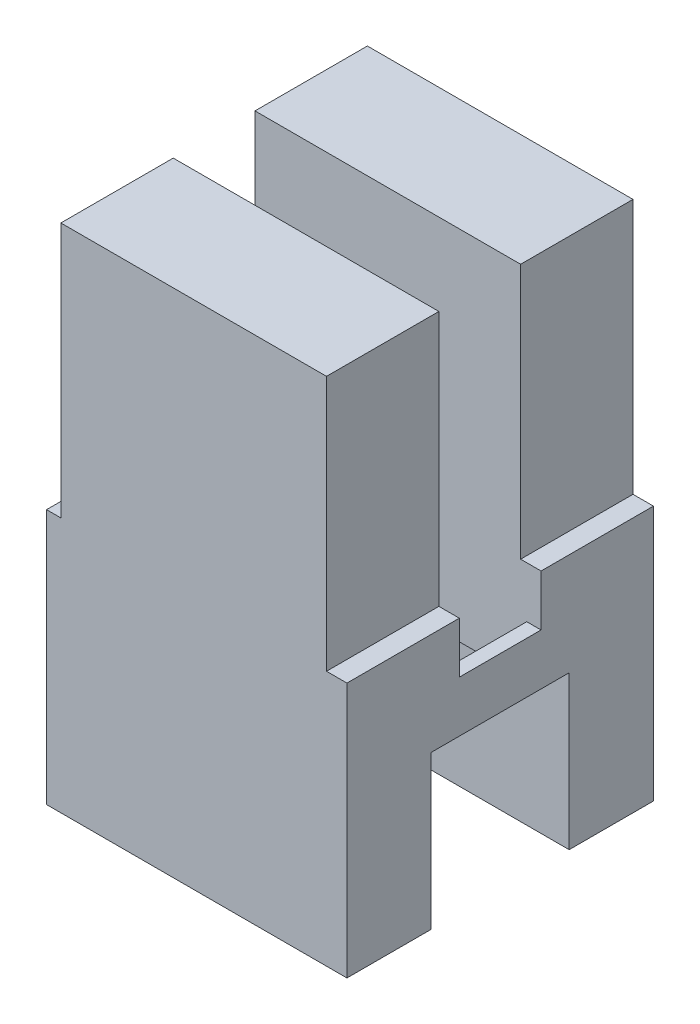
ISO-10303-21;
HEADER;
FILE_DESCRIPTION(('STEP AP214'),'2;1');
FILE_NAME('part.step','',(''),(''),'','','');
FILE_SCHEMA(('AUTOMOTIVE_DESIGN { 1 0 10303 214 1 1 1 1 }'));
ENDSEC;
DATA;
#1=APPLICATION_CONTEXT('core data for automotive mechanical design processes');
#2=APPLICATION_PROTOCOL_DEFINITION('international standard','automotive_design',2000,#1);
#3=PRODUCT_CONTEXT('',#1,'mechanical');
#4=PRODUCT('Part','Part','',(#3));
#5=PRODUCT_RELATED_PRODUCT_CATEGORY('part','',(#4));
#6=PRODUCT_DEFINITION_FORMATION('','',#4);
#7=PRODUCT_DEFINITION_CONTEXT('part definition',#1,'design');
#8=PRODUCT_DEFINITION('design','',#6,#7);
#9=PRODUCT_DEFINITION_SHAPE('','',#8);
#10=(LENGTH_UNIT() NAMED_UNIT(*) SI_UNIT(.MILLI.,.METRE.));
#11=(NAMED_UNIT(*) PLANE_ANGLE_UNIT() SI_UNIT($,.RADIAN.));
#12=(NAMED_UNIT(*) SI_UNIT($,.STERADIAN.) SOLID_ANGLE_UNIT());
#13=UNCERTAINTY_MEASURE_WITH_UNIT(LENGTH_MEASURE(1.E-05),#10,'distance_accuracy_value','');
#14=(GEOMETRIC_REPRESENTATION_CONTEXT(3) GLOBAL_UNCERTAINTY_ASSIGNED_CONTEXT((#13)) GLOBAL_UNIT_ASSIGNED_CONTEXT((#10,
#11,#12)) REPRESENTATION_CONTEXT('',''));
#15=CARTESIAN_POINT('',(0.,0.,0.));
#16=DIRECTION('',(0.,0.,1.));
#17=DIRECTION('',(1.,0.,0.));
#18=AXIS2_PLACEMENT_3D('',#15,#16,#17);
#19=CARTESIAN_POINT('',(18.669,63.5,-19.05));
#20=DIRECTION('',(-1.,0.,0.));
#21=DIRECTION('',(0.,0.,1.));
#22=AXIS2_PLACEMENT_3D('',#19,#20,#21);
#23=PLANE('',#22);
#24=DIRECTION('',(0.,0.,1.));
#25=VECTOR('',#24,1.);
#26=CARTESIAN_POINT('',(18.669,31.75,-19.05));
#27=LINE('',#26,#25);
#28=CARTESIAN_POINT('',(18.669,31.75,5.08));
#29=VERTEX_POINT('',#28);
#30=CARTESIAN_POINT('',(18.669,31.75,19.05));
#31=VERTEX_POINT('',#30);
#32=EDGE_CURVE('E59',#29,#31,#27,.T.);
#33=ORIENTED_EDGE('',*,*,#32,.T.);
#34=DIRECTION('',(0.,-1.,0.));
#35=VECTOR('',#34,1.);
#36=CARTESIAN_POINT('',(18.669,63.5,19.05));
#37=LINE('',#36,#35);
#38=CARTESIAN_POINT('',(18.669,0.,19.05));
#39=VERTEX_POINT('',#38);
#40=EDGE_CURVE('E227',#31,#39,#37,.T.);
#41=ORIENTED_EDGE('',*,*,#40,.T.);
#42=DIRECTION('',(0.,0.,-1.));
#43=VECTOR('',#42,1.);
#44=CARTESIAN_POINT('',(18.669,0.,-19.05));
#45=LINE('',#44,#43);
#46=CARTESIAN_POINT('',(18.669,0.,8.5725));
#47=VERTEX_POINT('',#46);
#48=EDGE_CURVE('E236',#39,#47,#45,.T.);
#49=ORIENTED_EDGE('',*,*,#48,.T.);
#50=DIRECTION('',(0.,-1.,0.));
#51=VECTOR('',#50,1.);
#52=CARTESIAN_POINT('',(18.669,66.4862175066043,8.5725));
#53=LINE('',#52,#51);
#54=CARTESIAN_POINT('',(18.669,19.05,8.5725));
#55=VERTEX_POINT('',#54);
#56=EDGE_CURVE('E304',#55,#47,#53,.T.);
#57=ORIENTED_EDGE('',*,*,#56,.F.);
#58=DIRECTION('',(0.,0.,1.));
#59=VECTOR('',#58,1.);
#60=CARTESIAN_POINT('',(18.669,19.05,-8.5725));
#61=LINE('',#60,#59);
#62=CARTESIAN_POINT('',(18.669,19.05,-8.5725));
#63=VERTEX_POINT('',#62);
#64=EDGE_CURVE('E370',#63,#55,#61,.T.);
#65=ORIENTED_EDGE('',*,*,#64,.F.);
#66=DIRECTION('',(0.,-1.,0.));
#67=VECTOR('',#66,1.);
#68=CARTESIAN_POINT('',(18.669,66.4862175066043,-8.5725));
#69=LINE('',#68,#67);
#70=CARTESIAN_POINT('',(18.669,0.,-8.5725));
#71=VERTEX_POINT('',#70);
#72=EDGE_CURVE('E373',#63,#71,#69,.T.);
#73=ORIENTED_EDGE('',*,*,#72,.T.);
#74=CARTESIAN_POINT('',(18.669,0.,-19.05));
#75=VERTEX_POINT('',#74);
#76=EDGE_CURVE('E240',#71,#75,#45,.T.);
#77=ORIENTED_EDGE('',*,*,#76,.T.);
#78=DIRECTION('',(0.,-1.,0.));
#79=VECTOR('',#78,1.);
#80=CARTESIAN_POINT('',(18.669,63.5,-19.05));
#81=LINE('',#80,#79);
#82=CARTESIAN_POINT('',(18.669,31.75,-19.05));
#83=VERTEX_POINT('',#82);
#84=EDGE_CURVE('E251',#83,#75,#81,.T.);
#85=ORIENTED_EDGE('',*,*,#84,.F.);
#86=CARTESIAN_POINT('',(18.669,31.75,-5.08));
#87=VERTEX_POINT('',#86);
#88=EDGE_CURVE('E273',#83,#87,#27,.T.);
#89=ORIENTED_EDGE('',*,*,#88,.T.);
#90=DIRECTION('',(0.,1.,0.));
#91=VECTOR('',#90,1.);
#92=CARTESIAN_POINT('',(18.669,25.4,-5.08));
#93=LINE('',#92,#91);
#94=CARTESIAN_POINT('',(18.669,25.4,-5.08));
#95=VERTEX_POINT('',#94);
#96=EDGE_CURVE('E233',#95,#87,#93,.T.);
#97=ORIENTED_EDGE('',*,*,#96,.F.);
#98=DIRECTION('',(0.,0.,-1.));
#99=VECTOR('',#98,1.);
#100=CARTESIAN_POINT('',(18.669,25.4,-5.08));
#101=LINE('',#100,#99);
#102=CARTESIAN_POINT('',(18.669,25.4,5.08));
#103=VERTEX_POINT('',#102);
#104=EDGE_CURVE('E307',#103,#95,#101,.T.);
#105=ORIENTED_EDGE('',*,*,#104,.F.);
#106=DIRECTION('',(0.,1.,0.));
#107=VECTOR('',#106,1.);
#108=CARTESIAN_POINT('',(18.669,25.4,5.08));
#109=LINE('',#108,#107);
#110=EDGE_CURVE('E308',#103,#29,#109,.T.);
#111=ORIENTED_EDGE('',*,*,#110,.T.);
#112=EDGE_LOOP('',(#33,#41,#49,#57,#65,#73,#77,#85,#89,#97,#105,#111));
#113=FACE_BOUND('',#112,.T.);
#114=ADVANCED_FACE('F37',(#113),#23,.F.);
#115=CARTESIAN_POINT('',(-18.669,63.5,-19.05));
#116=DIRECTION('',(1.,0.,0.));
#117=DIRECTION('',(0.,0.,-1.));
#118=AXIS2_PLACEMENT_3D('',#115,#116,#117);
#119=PLANE('',#118);
#120=DIRECTION('',(0.,0.,-1.));
#121=VECTOR('',#120,1.);
#122=CARTESIAN_POINT('',(-18.669,31.75,-19.05));
#123=LINE('',#122,#121);
#124=CARTESIAN_POINT('',(-18.669,31.75,-5.08));
#125=VERTEX_POINT('',#124);
#126=CARTESIAN_POINT('',(-18.669,31.75,-19.05));
#127=VERTEX_POINT('',#126);
#128=EDGE_CURVE('E328',#125,#127,#123,.T.);
#129=ORIENTED_EDGE('',*,*,#128,.T.);
#130=DIRECTION('',(0.,-1.,0.));
#131=VECTOR('',#130,1.);
#132=CARTESIAN_POINT('',(-18.669,63.5,-19.05));
#133=LINE('',#132,#131);
#134=CARTESIAN_POINT('',(-18.669,0.,-19.05));
#135=VERTEX_POINT('',#134);
#136=EDGE_CURVE('E249',#127,#135,#133,.T.);
#137=ORIENTED_EDGE('',*,*,#136,.T.);
#138=DIRECTION('',(0.,0.,1.));
#139=VECTOR('',#138,1.);
#140=CARTESIAN_POINT('',(-18.669,0.,-19.05));
#141=LINE('',#140,#139);
#142=CARTESIAN_POINT('',(-18.669,0.,-8.5725));
#143=VERTEX_POINT('',#142);
#144=EDGE_CURVE('E230',#135,#143,#141,.T.);
#145=ORIENTED_EDGE('',*,*,#144,.T.);
#146=DIRECTION('',(0.,-1.,0.));
#147=VECTOR('',#146,1.);
#148=CARTESIAN_POINT('',(-18.669,66.4862175066043,-8.5725));
#149=LINE('',#148,#147);
#150=CARTESIAN_POINT('',(-18.669,19.05,-8.5725));
#151=VERTEX_POINT('',#150);
#152=EDGE_CURVE('E377',#151,#143,#149,.T.);
#153=ORIENTED_EDGE('',*,*,#152,.F.);
#154=DIRECTION('',(0.,0.,-1.));
#155=VECTOR('',#154,1.);
#156=CARTESIAN_POINT('',(-18.669,19.05,-8.5725));
#157=LINE('',#156,#155);
#158=CARTESIAN_POINT('',(-18.669,19.05,8.5725));
#159=VERTEX_POINT('',#158);
#160=EDGE_CURVE('E378',#159,#151,#157,.T.);
#161=ORIENTED_EDGE('',*,*,#160,.F.);
#162=DIRECTION('',(0.,-1.,0.));
#163=VECTOR('',#162,1.);
#164=CARTESIAN_POINT('',(-18.669,66.4862175066043,8.5725));
#165=LINE('',#164,#163);
#166=CARTESIAN_POINT('',(-18.669,0.,8.5725));
#167=VERTEX_POINT('',#166);
#168=EDGE_CURVE('E369',#159,#167,#165,.T.);
#169=ORIENTED_EDGE('',*,*,#168,.T.);
#170=CARTESIAN_POINT('',(-18.669,0.,19.05));
#171=VERTEX_POINT('',#170);
#172=EDGE_CURVE('E243',#167,#171,#141,.T.);
#173=ORIENTED_EDGE('',*,*,#172,.T.);
#174=DIRECTION('',(0.,-1.,0.));
#175=VECTOR('',#174,1.);
#176=CARTESIAN_POINT('',(-18.669,63.5,19.05));
#177=LINE('',#176,#175);
#178=CARTESIAN_POINT('',(-18.669,31.75,19.05));
#179=VERTEX_POINT('',#178);
#180=EDGE_CURVE('E247',#179,#171,#177,.T.);
#181=ORIENTED_EDGE('',*,*,#180,.F.);
#182=CARTESIAN_POINT('',(-18.669,31.75,5.08));
#183=VERTEX_POINT('',#182);
#184=EDGE_CURVE('E324',#179,#183,#123,.T.);
#185=ORIENTED_EDGE('',*,*,#184,.T.);
#186=DIRECTION('',(0.,1.,0.));
#187=VECTOR('',#186,1.);
#188=CARTESIAN_POINT('',(-18.669,25.4,5.08));
#189=LINE('',#188,#187);
#190=CARTESIAN_POINT('',(-18.669,25.4,5.08));
#191=VERTEX_POINT('',#190);
#192=EDGE_CURVE('E291',#191,#183,#189,.T.);
#193=ORIENTED_EDGE('',*,*,#192,.F.);
#194=DIRECTION('',(0.,0.,1.));
#195=VECTOR('',#194,1.);
#196=CARTESIAN_POINT('',(-18.669,25.4,-5.08));
#197=LINE('',#196,#195);
#198=CARTESIAN_POINT('',(-18.669,25.4,-5.08));
#199=VERTEX_POINT('',#198);
#200=EDGE_CURVE('E298',#199,#191,#197,.T.);
#201=ORIENTED_EDGE('',*,*,#200,.F.);
#202=DIRECTION('',(0.,1.,0.));
#203=VECTOR('',#202,1.);
#204=CARTESIAN_POINT('',(-18.669,25.4,-5.08));
#205=LINE('',#204,#203);
#206=EDGE_CURVE('E288',#199,#125,#205,.T.);
#207=ORIENTED_EDGE('',*,*,#206,.T.);
#208=EDGE_LOOP('',(#129,#137,#145,#153,#161,#169,#173,#181,#185,#193,#201,#207));
#209=FACE_BOUND('',#208,.T.);
#210=ADVANCED_FACE('F322',(#209),#119,.F.);
#211=CARTESIAN_POINT('',(0.,25.4,0.));
#212=DIRECTION('',(0.,1.,0.));
#213=DIRECTION('',(0.,0.,1.));
#214=AXIS2_PLACEMENT_3D('',#211,#212,#213);
#215=PLANE('',#214);
#216=DIRECTION('',(0.,0.,-1.));
#217=VECTOR('',#216,1.);
#218=CARTESIAN_POINT('',(16.891,25.4,5.08));
#219=LINE('',#218,#217);
#220=CARTESIAN_POINT('',(16.891,25.4,5.08));
#221=VERTEX_POINT('',#220);
#222=CARTESIAN_POINT('',(16.891,25.4,-5.08));
#223=VERTEX_POINT('',#222);
#224=EDGE_CURVE('E349',#221,#223,#219,.T.);
#225=ORIENTED_EDGE('',*,*,#224,.F.);
#226=DIRECTION('',(1.,0.,0.));
#227=VECTOR('',#226,1.);
#228=CARTESIAN_POINT('',(-18.669,25.4,5.08));
#229=LINE('',#228,#227);
#230=EDGE_CURVE('E293',#221,#103,#229,.T.);
#231=ORIENTED_EDGE('',*,*,#230,.T.);
#232=ORIENTED_EDGE('',*,*,#104,.T.);
#233=DIRECTION('',(-1.,0.,0.));
#234=VECTOR('',#233,1.);
#235=CARTESIAN_POINT('',(-18.669,25.4,-5.08));
#236=LINE('',#235,#234);
#237=EDGE_CURVE('E286',#95,#223,#236,.T.);
#238=ORIENTED_EDGE('',*,*,#237,.T.);
#239=EDGE_LOOP('',(#225,#231,#232,#238));
#240=FACE_BOUND('',#239,.T.);
#241=ADVANCED_FACE('F446',(#240),#215,.T.);
#242=CARTESIAN_POINT('',(0.,0.,0.));
#243=DIRECTION('',(0.,1.,0.));
#244=DIRECTION('',(0.,0.,1.));
#245=AXIS2_PLACEMENT_3D('',#242,#243,#244);
#246=PLANE('',#245);
#247=ORIENTED_EDGE('',*,*,#172,.F.);
#248=DIRECTION('',(-1.,0.,0.));
#249=VECTOR('',#248,1.);
#250=CARTESIAN_POINT('',(-18.669,0.,8.5725));
#251=LINE('',#250,#249);
#252=EDGE_CURVE('E357',#47,#167,#251,.T.);
#253=ORIENTED_EDGE('',*,*,#252,.F.);
#254=ORIENTED_EDGE('',*,*,#48,.F.);
#255=DIRECTION('',(1.,0.,0.));
#256=VECTOR('',#255,1.);
#257=CARTESIAN_POINT('',(-18.669,0.,19.05));
#258=LINE('',#257,#256);
#259=EDGE_CURVE('E224',#171,#39,#258,.T.);
#260=ORIENTED_EDGE('',*,*,#259,.F.);
#261=EDGE_LOOP('',(#247,#253,#254,#260));
#262=FACE_BOUND('',#261,.T.);
#263=ADVANCED_FACE('F416',(#262),#246,.F.);
#264=CARTESIAN_POINT('',(0.,63.5,0.));
#265=DIRECTION('',(0.,1.,0.));
#266=DIRECTION('',(0.,0.,1.));
#267=AXIS2_PLACEMENT_3D('',#264,#265,#266);
#268=PLANE('',#267);
#269=DIRECTION('',(0.,0.,1.));
#270=VECTOR('',#269,1.);
#271=CARTESIAN_POINT('',(16.129,63.5,-19.05));
#272=LINE('',#271,#270);
#273=CARTESIAN_POINT('',(16.129,63.5,5.07999999999999));
#274=VERTEX_POINT('',#273);
#275=CARTESIAN_POINT('',(16.129,63.5,19.05));
#276=VERTEX_POINT('',#275);
#277=EDGE_CURVE('E216',#274,#276,#272,.T.);
#278=ORIENTED_EDGE('',*,*,#277,.F.);
#279=DIRECTION('',(1.,0.,0.));
#280=VECTOR('',#279,1.);
#281=CARTESIAN_POINT('',(-18.669,63.5,5.08));
#282=LINE('',#281,#280);
#283=CARTESIAN_POINT('',(-16.891,63.5,5.07999999999999));
#284=VERTEX_POINT('',#283);
#285=EDGE_CURVE('E303',#284,#274,#282,.T.);
#286=ORIENTED_EDGE('',*,*,#285,.F.);
#287=DIRECTION('',(0.,0.,-1.));
#288=VECTOR('',#287,1.);
#289=CARTESIAN_POINT('',(-16.891,63.5,-19.05));
#290=LINE('',#289,#288);
#291=CARTESIAN_POINT('',(-16.891,63.5,19.05));
#292=VERTEX_POINT('',#291);
#293=EDGE_CURVE('E335',#292,#284,#290,.T.);
#294=ORIENTED_EDGE('',*,*,#293,.F.);
#295=DIRECTION('',(1.,0.,0.));
#296=VECTOR('',#295,1.);
#297=CARTESIAN_POINT('',(-18.669,63.5,19.05));
#298=LINE('',#297,#296);
#299=EDGE_CURVE('E223',#292,#276,#298,.T.);
#300=ORIENTED_EDGE('',*,*,#299,.T.);
#301=EDGE_LOOP('',(#278,#286,#294,#300));
#302=FACE_BOUND('',#301,.T.);
#303=ADVANCED_FACE('F455',(#302),#268,.T.);
#304=CARTESIAN_POINT('',(-18.669,63.5,-19.05));
#305=DIRECTION('',(0.,0.,1.));
#306=DIRECTION('',(1.,0.,0.));
#307=AXIS2_PLACEMENT_3D('',#304,#305,#306);
#308=PLANE('',#307);
#309=DIRECTION('',(-1.,0.,0.));
#310=VECTOR('',#309,1.);
#311=CARTESIAN_POINT('',(-18.669,63.5,-19.05));
#312=LINE('',#311,#310);
#313=CARTESIAN_POINT('',(16.129,63.5,-19.05));
#314=VERTEX_POINT('',#313);
#315=CARTESIAN_POINT('',(-16.891,63.5,-19.05));
#316=VERTEX_POINT('',#315);
#317=EDGE_CURVE('E213',#314,#316,#312,.T.);
#318=ORIENTED_EDGE('',*,*,#317,.F.);
#319=DIRECTION('',(0.,1.,0.));
#320=VECTOR('',#319,1.);
#321=CARTESIAN_POINT('',(16.129,-12.7845728010672,-19.05));
#322=LINE('',#321,#320);
#323=CARTESIAN_POINT('',(16.129,31.75,-19.05));
#324=VERTEX_POINT('',#323);
#325=EDGE_CURVE('E196',#324,#314,#322,.T.);
#326=ORIENTED_EDGE('',*,*,#325,.F.);
#327=DIRECTION('',(1.,0.,0.));
#328=VECTOR('',#327,1.);
#329=CARTESIAN_POINT('',(18.669,31.75,-19.05));
#330=LINE('',#329,#328);
#331=EDGE_CURVE('E281',#324,#83,#330,.T.);
#332=ORIENTED_EDGE('',*,*,#331,.T.);
#333=ORIENTED_EDGE('',*,*,#84,.T.);
#334=DIRECTION('',(-1.,0.,0.));
#335=VECTOR('',#334,1.);
#336=CARTESIAN_POINT('',(-18.669,0.,-19.05));
#337=LINE('',#336,#335);
#338=EDGE_CURVE('E239',#75,#135,#337,.T.);
#339=ORIENTED_EDGE('',*,*,#338,.T.);
#340=ORIENTED_EDGE('',*,*,#136,.F.);
#341=DIRECTION('',(1.,0.,0.));
#342=VECTOR('',#341,1.);
#343=CARTESIAN_POINT('',(-18.669,31.75,-19.05));
#344=LINE('',#343,#342);
#345=CARTESIAN_POINT('',(-16.891,31.75,-19.05));
#346=VERTEX_POINT('',#345);
#347=EDGE_CURVE('E331',#127,#346,#344,.T.);
#348=ORIENTED_EDGE('',*,*,#347,.T.);
#349=DIRECTION('',(0.,1.,0.));
#350=VECTOR('',#349,1.);
#351=CARTESIAN_POINT('',(-16.891,-12.7845728010672,-19.05));
#352=LINE('',#351,#350);
#353=EDGE_CURVE('E222',#346,#316,#352,.T.);
#354=ORIENTED_EDGE('',*,*,#353,.T.);
#355=EDGE_LOOP('',(#318,#326,#332,#333,#339,#340,#348,#354));
#356=FACE_BOUND('',#355,.T.);
#357=ADVANCED_FACE('F219',(#356),#308,.F.);
#358=CARTESIAN_POINT('',(-18.669,63.5,19.05));
#359=DIRECTION('',(0.,0.,-1.));
#360=DIRECTION('',(-1.,0.,0.));
#361=AXIS2_PLACEMENT_3D('',#358,#359,#360);
#362=PLANE('',#361);
#363=DIRECTION('',(-1.,0.,0.));
#364=VECTOR('',#363,1.);
#365=CARTESIAN_POINT('',(18.669,31.75,19.05));
#366=LINE('',#365,#364);
#367=CARTESIAN_POINT('',(16.129,31.75,19.05));
#368=VERTEX_POINT('',#367);
#369=EDGE_CURVE('E501',#31,#368,#366,.T.);
#370=ORIENTED_EDGE('',*,*,#369,.T.);
#371=DIRECTION('',(0.,1.,0.));
#372=VECTOR('',#371,1.);
#373=CARTESIAN_POINT('',(16.129,-12.7845728010672,19.05));
#374=LINE('',#373,#372);
#375=EDGE_CURVE('E206',#368,#276,#374,.T.);
#376=ORIENTED_EDGE('',*,*,#375,.T.);
#377=ORIENTED_EDGE('',*,*,#299,.F.);
#378=DIRECTION('',(0.,1.,0.));
#379=VECTOR('',#378,1.);
#380=CARTESIAN_POINT('',(-16.891,-12.7845728010672,19.05));
#381=LINE('',#380,#379);
#382=CARTESIAN_POINT('',(-16.891,31.75,19.05));
#383=VERTEX_POINT('',#382);
#384=EDGE_CURVE('E337',#383,#292,#381,.T.);
#385=ORIENTED_EDGE('',*,*,#384,.F.);
#386=DIRECTION('',(-1.,0.,0.));
#387=VECTOR('',#386,1.);
#388=CARTESIAN_POINT('',(-18.669,31.75,19.05));
#389=LINE('',#388,#387);
#390=EDGE_CURVE('E327',#383,#179,#389,.T.);
#391=ORIENTED_EDGE('',*,*,#390,.T.);
#392=ORIENTED_EDGE('',*,*,#180,.T.);
#393=ORIENTED_EDGE('',*,*,#259,.T.);
#394=ORIENTED_EDGE('',*,*,#40,.F.);
#395=EDGE_LOOP('',(#370,#376,#377,#385,#391,#392,#393,#394));
#396=FACE_BOUND('',#395,.T.);
#397=ADVANCED_FACE('F421',(#396),#362,.F.);
#398=CARTESIAN_POINT('',(16.129,63.5,-5.08));
#399=VERTEX_POINT('',#398);
#400=EDGE_CURVE('E200',#314,#399,#272,.T.);
#401=ORIENTED_EDGE('',*,*,#400,.F.);
#402=ORIENTED_EDGE('',*,*,#317,.T.);
#403=CARTESIAN_POINT('',(-16.891,63.5,-5.08));
#404=VERTEX_POINT('',#403);
#405=EDGE_CURVE('E338',#404,#316,#290,.T.);
#406=ORIENTED_EDGE('',*,*,#405,.F.);
#407=DIRECTION('',(-1.,0.,0.));
#408=VECTOR('',#407,1.);
#409=CARTESIAN_POINT('',(-18.669,63.5,-5.08));
#410=LINE('',#409,#408);
#411=EDGE_CURVE('E215',#399,#404,#410,.T.);
#412=ORIENTED_EDGE('',*,*,#411,.F.);
#413=EDGE_LOOP('',(#401,#402,#406,#412));
#414=FACE_BOUND('',#413,.T.);
#415=ADVANCED_FACE('F211',(#414),#268,.T.);
#416=ORIENTED_EDGE('',*,*,#76,.F.);
#417=DIRECTION('',(1.,0.,0.));
#418=VECTOR('',#417,1.);
#419=CARTESIAN_POINT('',(-18.669,0.,-8.5725));
#420=LINE('',#419,#418);
#421=EDGE_CURVE('E363',#143,#71,#420,.T.);
#422=ORIENTED_EDGE('',*,*,#421,.F.);
#423=ORIENTED_EDGE('',*,*,#144,.F.);
#424=ORIENTED_EDGE('',*,*,#338,.F.);
#425=EDGE_LOOP('',(#416,#422,#423,#424));
#426=FACE_BOUND('',#425,.T.);
#427=ADVANCED_FACE('F401',(#426),#246,.F.);
#428=CARTESIAN_POINT('',(-18.669,25.4,5.08));
#429=DIRECTION('',(0.,0.,1.));
#430=DIRECTION('',(1.,0.,0.));
#431=AXIS2_PLACEMENT_3D('',#428,#429,#430);
#432=PLANE('',#431);
#433=ORIENTED_EDGE('',*,*,#285,.T.);
#434=DIRECTION('',(0.,-1.,0.));
#435=VECTOR('',#434,1.);
#436=CARTESIAN_POINT('',(16.129,25.4,5.08));
#437=LINE('',#436,#435);
#438=CARTESIAN_POINT('',(16.129,31.75,5.08));
#439=VERTEX_POINT('',#438);
#440=EDGE_CURVE('E346',#274,#439,#437,.T.);
#441=ORIENTED_EDGE('',*,*,#440,.T.);
#442=DIRECTION('',(-1.,0.,0.));
#443=VECTOR('',#442,1.);
#444=CARTESIAN_POINT('',(-18.669,31.75,5.08));
#445=LINE('',#444,#443);
#446=EDGE_CURVE('E344',#29,#439,#445,.T.);
#447=ORIENTED_EDGE('',*,*,#446,.F.);
#448=ORIENTED_EDGE('',*,*,#110,.F.);
#449=ORIENTED_EDGE('',*,*,#230,.F.);
#450=DIRECTION('',(0.,1.,0.));
#451=VECTOR('',#450,1.);
#452=CARTESIAN_POINT('',(16.891,0.,5.08));
#453=LINE('',#452,#451);
#454=CARTESIAN_POINT('',(16.891,19.05,5.08));
#455=VERTEX_POINT('',#454);
#456=EDGE_CURVE('E355',#455,#221,#453,.T.);
#457=ORIENTED_EDGE('',*,*,#456,.F.);
#458=DIRECTION('',(1.,0.,0.));
#459=VECTOR('',#458,1.);
#460=CARTESIAN_POINT('',(0.,19.05,5.08));
#461=LINE('',#460,#459);
#462=CARTESIAN_POINT('',(-16.891,19.05,5.08));
#463=VERTEX_POINT('',#462);
#464=EDGE_CURVE('E259',#463,#455,#461,.T.);
#465=ORIENTED_EDGE('',*,*,#464,.F.);
#466=DIRECTION('',(0.,1.,0.));
#467=VECTOR('',#466,1.);
#468=CARTESIAN_POINT('',(-16.891,0.,5.08));
#469=LINE('',#468,#467);
#470=CARTESIAN_POINT('',(-16.891,25.4,5.08));
#471=VERTEX_POINT('',#470);
#472=EDGE_CURVE('E358',#463,#471,#469,.T.);
#473=ORIENTED_EDGE('',*,*,#472,.T.);
#474=EDGE_CURVE('E289',#191,#471,#229,.T.);
#475=ORIENTED_EDGE('',*,*,#474,.F.);
#476=ORIENTED_EDGE('',*,*,#192,.T.);
#477=DIRECTION('',(-1.,0.,0.));
#478=VECTOR('',#477,1.);
#479=CARTESIAN_POINT('',(-18.669,31.75,5.08));
#480=LINE('',#479,#478);
#481=CARTESIAN_POINT('',(-16.891,31.75,5.08));
#482=VERTEX_POINT('',#481);
#483=EDGE_CURVE('E317',#482,#183,#480,.T.);
#484=ORIENTED_EDGE('',*,*,#483,.F.);
#485=DIRECTION('',(0.,1.,0.));
#486=VECTOR('',#485,1.);
#487=CARTESIAN_POINT('',(-16.891,25.4,5.08));
#488=LINE('',#487,#486);
#489=EDGE_CURVE('E342',#482,#284,#488,.T.);
#490=ORIENTED_EDGE('',*,*,#489,.T.);
#491=EDGE_LOOP('',(#433,#441,#447,#448,#449,#457,#465,#473,#475,#476,#484,#490));
#492=FACE_BOUND('',#491,.T.);
#493=ADVANCED_FACE('F315',(#492),#432,.F.);
#494=CARTESIAN_POINT('',(-18.669,25.4,-5.08));
#495=DIRECTION('',(0.,0.,-1.));
#496=DIRECTION('',(-1.,0.,0.));
#497=AXIS2_PLACEMENT_3D('',#494,#495,#496);
#498=PLANE('',#497);
#499=DIRECTION('',(1.,0.,0.));
#500=VECTOR('',#499,1.);
#501=CARTESIAN_POINT('',(-18.669,31.75,-5.08));
#502=LINE('',#501,#500);
#503=CARTESIAN_POINT('',(16.129,31.75,-5.08));
#504=VERTEX_POINT('',#503);
#505=EDGE_CURVE('E44',#504,#87,#502,.T.);
#506=ORIENTED_EDGE('',*,*,#505,.F.);
#507=DIRECTION('',(0.,1.,0.));
#508=VECTOR('',#507,1.);
#509=CARTESIAN_POINT('',(16.129,25.4,-5.08));
#510=LINE('',#509,#508);
#511=EDGE_CURVE('E13',#504,#399,#510,.T.);
#512=ORIENTED_EDGE('',*,*,#511,.T.);
#513=ORIENTED_EDGE('',*,*,#411,.T.);
#514=DIRECTION('',(0.,-1.,0.));
#515=VECTOR('',#514,1.);
#516=CARTESIAN_POINT('',(-16.891,25.4,-5.08));
#517=LINE('',#516,#515);
#518=CARTESIAN_POINT('',(-16.891,31.75,-5.08));
#519=VERTEX_POINT('',#518);
#520=EDGE_CURVE('E267',#404,#519,#517,.T.);
#521=ORIENTED_EDGE('',*,*,#520,.T.);
#522=DIRECTION('',(1.,0.,0.));
#523=VECTOR('',#522,1.);
#524=CARTESIAN_POINT('',(-18.669,31.75,-5.08));
#525=LINE('',#524,#523);
#526=EDGE_CURVE('E265',#125,#519,#525,.T.);
#527=ORIENTED_EDGE('',*,*,#526,.F.);
#528=ORIENTED_EDGE('',*,*,#206,.F.);
#529=CARTESIAN_POINT('',(-16.891,25.4,-5.08));
#530=VERTEX_POINT('',#529);
#531=EDGE_CURVE('E387',#530,#199,#236,.T.);
#532=ORIENTED_EDGE('',*,*,#531,.F.);
#533=DIRECTION('',(0.,1.,0.));
#534=VECTOR('',#533,1.);
#535=CARTESIAN_POINT('',(-16.891,0.,-5.08));
#536=LINE('',#535,#534);
#537=CARTESIAN_POINT('',(-16.891,19.05,-5.08));
#538=VERTEX_POINT('',#537);
#539=EDGE_CURVE('E360',#538,#530,#536,.T.);
#540=ORIENTED_EDGE('',*,*,#539,.F.);
#541=DIRECTION('',(-1.,0.,0.));
#542=VECTOR('',#541,1.);
#543=CARTESIAN_POINT('',(0.,19.05,-5.08));
#544=LINE('',#543,#542);
#545=CARTESIAN_POINT('',(16.891,19.05,-5.08));
#546=VERTEX_POINT('',#545);
#547=EDGE_CURVE('E253',#546,#538,#544,.T.);
#548=ORIENTED_EDGE('',*,*,#547,.F.);
#549=DIRECTION('',(0.,1.,0.));
#550=VECTOR('',#549,1.);
#551=CARTESIAN_POINT('',(16.891,0.,-5.08));
#552=LINE('',#551,#550);
#553=EDGE_CURVE('E354',#546,#223,#552,.T.);
#554=ORIENTED_EDGE('',*,*,#553,.T.);
#555=ORIENTED_EDGE('',*,*,#237,.F.);
#556=ORIENTED_EDGE('',*,*,#96,.T.);
#557=EDGE_LOOP('',(#506,#512,#513,#521,#527,#528,#532,#540,#548,#554,#555,#556));
#558=FACE_BOUND('',#557,.T.);
#559=ADVANCED_FACE('F283',(#558),#498,.F.);
#560=DIRECTION('',(0.,0.,1.));
#561=VECTOR('',#560,1.);
#562=CARTESIAN_POINT('',(-16.891,25.4,5.08));
#563=LINE('',#562,#561);
#564=EDGE_CURVE('E351',#530,#471,#563,.T.);
#565=ORIENTED_EDGE('',*,*,#564,.F.);
#566=ORIENTED_EDGE('',*,*,#531,.T.);
#567=ORIENTED_EDGE('',*,*,#200,.T.);
#568=ORIENTED_EDGE('',*,*,#474,.T.);
#569=EDGE_LOOP('',(#565,#566,#567,#568));
#570=FACE_BOUND('',#569,.T.);
#571=ADVANCED_FACE('F392',(#570),#215,.T.);
#572=CARTESIAN_POINT('',(0.,19.05,0.));
#573=DIRECTION('',(0.,1.,0.));
#574=DIRECTION('',(0.,0.,1.));
#575=AXIS2_PLACEMENT_3D('',#572,#573,#574);
#576=PLANE('',#575);
#577=ORIENTED_EDGE('',*,*,#464,.T.);
#578=DIRECTION('',(0.,0.,-1.));
#579=VECTOR('',#578,1.);
#580=CARTESIAN_POINT('',(16.891,19.05,0.));
#581=LINE('',#580,#579);
#582=EDGE_CURVE('E262',#455,#546,#581,.T.);
#583=ORIENTED_EDGE('',*,*,#582,.T.);
#584=ORIENTED_EDGE('',*,*,#547,.T.);
#585=DIRECTION('',(0.,0.,1.));
#586=VECTOR('',#585,1.);
#587=CARTESIAN_POINT('',(-16.891,19.05,0.));
#588=LINE('',#587,#586);
#589=EDGE_CURVE('E256',#538,#463,#588,.T.);
#590=ORIENTED_EDGE('',*,*,#589,.T.);
#591=EDGE_LOOP('',(#577,#583,#584,#590));
#592=FACE_BOUND('',#591,.T.);
#593=ORIENTED_EDGE('',*,*,#64,.T.);
#594=DIRECTION('',(-1.,0.,0.));
#595=VECTOR('',#594,1.);
#596=CARTESIAN_POINT('',(-18.669,19.05,8.5725));
#597=LINE('',#596,#595);
#598=EDGE_CURVE('E365',#55,#159,#597,.T.);
#599=ORIENTED_EDGE('',*,*,#598,.T.);
#600=ORIENTED_EDGE('',*,*,#160,.T.);
#601=DIRECTION('',(1.,0.,0.));
#602=VECTOR('',#601,1.);
#603=CARTESIAN_POINT('',(-18.669,19.05,-8.5725));
#604=LINE('',#603,#602);
#605=EDGE_CURVE('E374',#151,#63,#604,.T.);
#606=ORIENTED_EDGE('',*,*,#605,.T.);
#607=EDGE_LOOP('',(#593,#599,#600,#606));
#608=FACE_BOUND('',#607,.T.);
#609=ADVANCED_FACE('F408',(#592,#608),#576,.F.);
#610=CARTESIAN_POINT('',(-18.669,66.4862175066043,8.5725));
#611=DIRECTION('',(0.,0.,1.));
#612=DIRECTION('',(1.,0.,0.));
#613=AXIS2_PLACEMENT_3D('',#610,#611,#612);
#614=PLANE('',#613);
#615=ORIENTED_EDGE('',*,*,#56,.T.);
#616=ORIENTED_EDGE('',*,*,#252,.T.);
#617=ORIENTED_EDGE('',*,*,#168,.F.);
#618=ORIENTED_EDGE('',*,*,#598,.F.);
#619=EDGE_LOOP('',(#615,#616,#617,#618));
#620=FACE_BOUND('',#619,.T.);
#621=ADVANCED_FACE('F411',(#620),#614,.F.);
#622=CARTESIAN_POINT('',(-18.669,66.4862175066043,-8.5725));
#623=DIRECTION('',(0.,0.,-1.));
#624=DIRECTION('',(-1.,0.,0.));
#625=AXIS2_PLACEMENT_3D('',#622,#623,#624);
#626=PLANE('',#625);
#627=ORIENTED_EDGE('',*,*,#152,.T.);
#628=ORIENTED_EDGE('',*,*,#421,.T.);
#629=ORIENTED_EDGE('',*,*,#72,.F.);
#630=ORIENTED_EDGE('',*,*,#605,.F.);
#631=EDGE_LOOP('',(#627,#628,#629,#630));
#632=FACE_BOUND('',#631,.T.);
#633=ADVANCED_FACE('F405',(#632),#626,.F.);
#634=CARTESIAN_POINT('',(16.891,0.,5.08));
#635=DIRECTION('',(1.,0.,0.));
#636=DIRECTION('',(0.,0.,-1.));
#637=AXIS2_PLACEMENT_3D('',#634,#635,#636);
#638=PLANE('',#637);
#639=ORIENTED_EDGE('',*,*,#456,.T.);
#640=ORIENTED_EDGE('',*,*,#224,.T.);
#641=ORIENTED_EDGE('',*,*,#553,.F.);
#642=ORIENTED_EDGE('',*,*,#582,.F.);
#643=EDGE_LOOP('',(#639,#640,#641,#642));
#644=FACE_BOUND('',#643,.T.);
#645=ADVANCED_FACE('F487',(#644),#638,.F.);
#646=CARTESIAN_POINT('',(-16.891,0.,5.08));
#647=DIRECTION('',(-1.,0.,0.));
#648=DIRECTION('',(0.,0.,1.));
#649=AXIS2_PLACEMENT_3D('',#646,#647,#648);
#650=PLANE('',#649);
#651=ORIENTED_EDGE('',*,*,#539,.T.);
#652=ORIENTED_EDGE('',*,*,#564,.T.);
#653=ORIENTED_EDGE('',*,*,#472,.F.);
#654=ORIENTED_EDGE('',*,*,#589,.F.);
#655=EDGE_LOOP('',(#651,#652,#653,#654));
#656=FACE_BOUND('',#655,.T.);
#657=ADVANCED_FACE('F441',(#656),#650,.F.);
#658=CARTESIAN_POINT('',(0.,31.75,0.));
#659=DIRECTION('',(0.,1.,0.));
#660=DIRECTION('',(0.,0.,1.));
#661=AXIS2_PLACEMENT_3D('',#658,#659,#660);
#662=PLANE('',#661);
#663=ORIENTED_EDGE('',*,*,#526,.T.);
#664=DIRECTION('',(0.,0.,1.));
#665=VECTOR('',#664,1.);
#666=CARTESIAN_POINT('',(-16.891,31.75,-19.05));
#667=LINE('',#666,#665);
#668=EDGE_CURVE('E508',#346,#519,#667,.T.);
#669=ORIENTED_EDGE('',*,*,#668,.F.);
#670=ORIENTED_EDGE('',*,*,#347,.F.);
#671=ORIENTED_EDGE('',*,*,#128,.F.);
#672=EDGE_LOOP('',(#663,#669,#670,#671));
#673=FACE_BOUND('',#672,.T.);
#674=ADVANCED_FACE('F429',(#673),#662,.T.);
#675=CARTESIAN_POINT('',(-16.891,-12.7845728010672,-19.05));
#676=DIRECTION('',(1.,0.,0.));
#677=DIRECTION('',(0.,0.,-1.));
#678=AXIS2_PLACEMENT_3D('',#675,#676,#677);
#679=PLANE('',#678);
#680=ORIENTED_EDGE('',*,*,#405,.T.);
#681=ORIENTED_EDGE('',*,*,#353,.F.);
#682=ORIENTED_EDGE('',*,*,#668,.T.);
#683=ORIENTED_EDGE('',*,*,#520,.F.);
#684=EDGE_LOOP('',(#680,#681,#682,#683));
#685=FACE_BOUND('',#684,.T.);
#686=ADVANCED_FACE('F439',(#685),#679,.F.);
#687=CARTESIAN_POINT('',(0.,31.75,0.));
#688=DIRECTION('',(0.,1.,0.));
#689=DIRECTION('',(0.,0.,1.));
#690=AXIS2_PLACEMENT_3D('',#687,#688,#689);
#691=PLANE('',#690);
#692=ORIENTED_EDGE('',*,*,#505,.T.);
#693=ORIENTED_EDGE('',*,*,#88,.F.);
#694=ORIENTED_EDGE('',*,*,#331,.F.);
#695=DIRECTION('',(0.,0.,-1.));
#696=VECTOR('',#695,1.);
#697=CARTESIAN_POINT('',(16.129,31.75,-19.05));
#698=LINE('',#697,#696);
#699=EDGE_CURVE('E201',#504,#324,#698,.T.);
#700=ORIENTED_EDGE('',*,*,#699,.F.);
#701=EDGE_LOOP('',(#692,#693,#694,#700));
#702=FACE_BOUND('',#701,.T.);
#703=ADVANCED_FACE('F272',(#702),#691,.T.);
#704=CARTESIAN_POINT('',(16.129,-12.7845728010672,-19.05));
#705=DIRECTION('',(-1.,0.,0.));
#706=DIRECTION('',(0.,0.,1.));
#707=AXIS2_PLACEMENT_3D('',#704,#705,#706);
#708=PLANE('',#707);
#709=ORIENTED_EDGE('',*,*,#699,.T.);
#710=ORIENTED_EDGE('',*,*,#325,.T.);
#711=ORIENTED_EDGE('',*,*,#400,.T.);
#712=ORIENTED_EDGE('',*,*,#511,.F.);
#713=EDGE_LOOP('',(#709,#710,#711,#712));
#714=FACE_BOUND('',#713,.T.);
#715=ADVANCED_FACE('F198',(#714),#708,.F.);
#716=EDGE_CURVE('E51',#482,#383,#667,.T.);
#717=ORIENTED_EDGE('',*,*,#716,.T.);
#718=ORIENTED_EDGE('',*,*,#384,.T.);
#719=ORIENTED_EDGE('',*,*,#293,.T.);
#720=ORIENTED_EDGE('',*,*,#489,.F.);
#721=EDGE_LOOP('',(#717,#718,#719,#720));
#722=FACE_BOUND('',#721,.T.);
#723=ADVANCED_FACE('F427',(#722),#679,.F.);
#724=ORIENTED_EDGE('',*,*,#483,.T.);
#725=ORIENTED_EDGE('',*,*,#184,.F.);
#726=ORIENTED_EDGE('',*,*,#390,.F.);
#727=ORIENTED_EDGE('',*,*,#716,.F.);
#728=EDGE_LOOP('',(#724,#725,#726,#727));
#729=FACE_BOUND('',#728,.T.);
#730=ADVANCED_FACE('F424',(#729),#662,.T.);
#731=ORIENTED_EDGE('',*,*,#277,.T.);
#732=ORIENTED_EDGE('',*,*,#375,.F.);
#733=EDGE_CURVE('E502',#368,#439,#698,.T.);
#734=ORIENTED_EDGE('',*,*,#733,.T.);
#735=ORIENTED_EDGE('',*,*,#440,.F.);
#736=EDGE_LOOP('',(#731,#732,#734,#735));
#737=FACE_BOUND('',#736,.T.);
#738=ADVANCED_FACE('F426',(#737),#708,.F.);
#739=ORIENTED_EDGE('',*,*,#446,.T.);
#740=ORIENTED_EDGE('',*,*,#733,.F.);
#741=ORIENTED_EDGE('',*,*,#369,.F.);
#742=ORIENTED_EDGE('',*,*,#32,.F.);
#743=EDGE_LOOP('',(#739,#740,#741,#742));
#744=FACE_BOUND('',#743,.T.);
#745=ADVANCED_FACE('F434',(#744),#691,.T.);
#746=CLOSED_SHELL('',(#114,#210,#241,#263,#303,#357,#397,#415,#427,#493,#559,#571,#609,#621,
#633,#645,#657,#674,#686,#703,#715,#723,#730,#738,#745));
#747=MANIFOLD_SOLID_BREP('B2',#746);
#748=ADVANCED_BREP_SHAPE_REPRESENTATION('',(#18,#747),#14);
#749=SHAPE_DEFINITION_REPRESENTATION(#9,#748);
ENDSEC;
END-ISO-10303-21;
